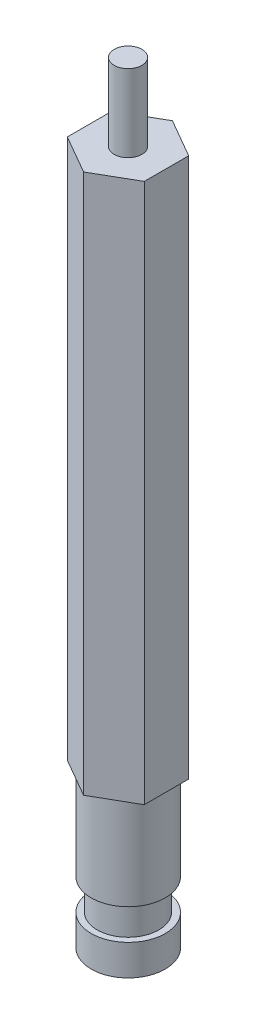
ISO-10303-21;
HEADER;
FILE_DESCRIPTION(('STEP AP214'),'2;1');
FILE_NAME('part.step','',(''),(''),'','','');
FILE_SCHEMA(('AUTOMOTIVE_DESIGN { 1 0 10303 214 1 1 1 1 }'));
ENDSEC;
DATA;
#1=APPLICATION_CONTEXT('core data for automotive mechanical design processes');
#2=APPLICATION_PROTOCOL_DEFINITION('international standard','automotive_design',2000,#1);
#3=PRODUCT_CONTEXT('',#1,'mechanical');
#4=PRODUCT('Part','Part','',(#3));
#5=PRODUCT_RELATED_PRODUCT_CATEGORY('part','',(#4));
#6=PRODUCT_DEFINITION_FORMATION('','',#4);
#7=PRODUCT_DEFINITION_CONTEXT('part definition',#1,'design');
#8=PRODUCT_DEFINITION('design','',#6,#7);
#9=PRODUCT_DEFINITION_SHAPE('','',#8);
#10=(LENGTH_UNIT() NAMED_UNIT(*) SI_UNIT(.MILLI.,.METRE.));
#11=(NAMED_UNIT(*) PLANE_ANGLE_UNIT() SI_UNIT($,.RADIAN.));
#12=(NAMED_UNIT(*) SI_UNIT($,.STERADIAN.) SOLID_ANGLE_UNIT());
#13=UNCERTAINTY_MEASURE_WITH_UNIT(LENGTH_MEASURE(1.E-05),#10,'distance_accuracy_value','');
#14=(GEOMETRIC_REPRESENTATION_CONTEXT(3) GLOBAL_UNCERTAINTY_ASSIGNED_CONTEXT((#13)) GLOBAL_UNIT_ASSIGNED_CONTEXT((#10,
#11,#12)) REPRESENTATION_CONTEXT('',''));
#15=CARTESIAN_POINT('',(0.,0.,0.));
#16=DIRECTION('',(0.,0.,1.));
#17=DIRECTION('',(1.,0.,0.));
#18=AXIS2_PLACEMENT_3D('',#15,#16,#17);
#19=CARTESIAN_POINT('',(0.152614949044713,12.7,2.58450279961206));
#20=DIRECTION('',(0.,-1.,0.));
#21=DIRECTION('',(0.,0.,-1.));
#22=AXIS2_PLACEMENT_3D('',#19,#20,#21);
#23=CYLINDRICAL_SURFACE('',#22,3.048);
#24=CARTESIAN_POINT('',(0.152614949044713,12.7,2.58450279961206));
#25=DIRECTION('',(0.,-1.,0.));
#26=DIRECTION('',(0.,0.,-1.));
#27=AXIS2_PLACEMENT_3D('',#24,#25,#26);
#28=CIRCLE('',#27,3.048);
#29=CARTESIAN_POINT('',(0.152614949044713,12.7,-0.463497200387935));
#30=VERTEX_POINT('',#29);
#31=EDGE_CURVE('E103',#30,#30,#28,.T.);
#32=ORIENTED_EDGE('',*,*,#31,.T.);
#33=EDGE_LOOP('',(#32));
#34=FACE_BOUND('',#33,.T.);
#35=CARTESIAN_POINT('',(0.152614949044713,5.08,2.58450279961206));
#36=DIRECTION('',(0.,-1.,0.));
#37=DIRECTION('',(0.,0.,-1.));
#38=AXIS2_PLACEMENT_3D('',#35,#36,#37);
#39=CIRCLE('',#38,3.048);
#40=CARTESIAN_POINT('',(0.152614949044713,5.08,-0.463497200387935));
#41=VERTEX_POINT('',#40);
#42=EDGE_CURVE('E40',#41,#41,#39,.F.);
#43=ORIENTED_EDGE('',*,*,#42,.T.);
#44=EDGE_LOOP('',(#43));
#45=FACE_BOUND('',#44,.T.);
#46=ADVANCED_FACE('F36',(#34,#45),#23,.T.);
#47=CARTESIAN_POINT('',(0.14076501932061,63.5,-1.06306101828332));
#48=DIRECTION('',(0.499122205111676,0.,0.86653160609666));
#49=DIRECTION('',(0.86653160609666,0.,-0.499122205111676));
#50=AXIS2_PLACEMENT_3D('',#47,#48,#49);
#51=PLANE('',#50);
#52=DIRECTION('',(0.86653160609666,0.,-0.499122205111676));
#53=VECTOR('',#52,1.);
#54=CARTESIAN_POINT('',(0.14076501932061,12.7,-1.06306101828332));
#55=LINE('',#54,#53);
#56=CARTESIAN_POINT('',(-3.02866098313853,12.7,0.762528359133148));
#57=VERTEX_POINT('',#56);
#58=CARTESIAN_POINT('',(0.14076501932061,12.7,-1.06306101828332));
#59=VERTEX_POINT('',#58);
#60=EDGE_CURVE('E52',#57,#59,#55,.T.);
#61=ORIENTED_EDGE('',*,*,#60,.F.);
#62=DIRECTION('',(0.,-1.,0.));
#63=VECTOR('',#62,1.);
#64=CARTESIAN_POINT('',(-3.02866098313853,63.5,0.762528359133148));
#65=LINE('',#64,#63);
#66=CARTESIAN_POINT('',(-3.02866098313853,57.15,0.762528359133148));
#67=VERTEX_POINT('',#66);
#68=EDGE_CURVE('E119',#67,#57,#65,.T.);
#69=ORIENTED_EDGE('',*,*,#68,.F.);
#70=DIRECTION('',(-0.86653160609666,0.,0.499122205111676));
#71=VECTOR('',#70,1.);
#72=CARTESIAN_POINT('',(0.14076501932061,57.15,-1.06306101828332));
#73=LINE('',#72,#71);
#74=CARTESIAN_POINT('',(0.14076501932061,57.15,-1.06306101828332));
#75=VERTEX_POINT('',#74);
#76=EDGE_CURVE('E110',#75,#67,#73,.T.);
#77=ORIENTED_EDGE('',*,*,#76,.F.);
#78=DIRECTION('',(0.,-1.,0.));
#79=VECTOR('',#78,1.);
#80=CARTESIAN_POINT('',(0.14076501932061,63.5,-1.06306101828332));
#81=LINE('',#80,#79);
#82=EDGE_CURVE('E106',#75,#59,#81,.T.);
#83=ORIENTED_EDGE('',*,*,#82,.T.);
#84=EDGE_LOOP('',(#61,#69,#77,#83));
#85=FACE_BOUND('',#84,.T.);
#86=ADVANCED_FACE('F38',(#85),#51,.F.);
#87=CARTESIAN_POINT('',(-3.02866098313853,63.5,0.762528359133148));
#88=DIRECTION('',(1.,0.,0.));
#89=DIRECTION('',(0.,0.,-1.));
#90=AXIS2_PLACEMENT_3D('',#87,#88,#89);
#91=PLANE('',#90);
#92=DIRECTION('',(0.,0.,-1.));
#93=VECTOR('',#92,1.);
#94=CARTESIAN_POINT('',(-3.02866098313853,12.7,0.762528359133148));
#95=LINE('',#94,#93);
#96=CARTESIAN_POINT('',(-3.02866098313853,12.7,4.42012835913315));
#97=VERTEX_POINT('',#96);
#98=EDGE_CURVE('E144',#97,#57,#95,.T.);
#99=ORIENTED_EDGE('',*,*,#98,.F.);
#100=DIRECTION('',(0.,-1.,0.));
#101=VECTOR('',#100,1.);
#102=CARTESIAN_POINT('',(-3.02866098313853,63.5,4.42012835913315));
#103=LINE('',#102,#101);
#104=CARTESIAN_POINT('',(-3.02866098313853,57.15,4.42012835913315));
#105=VERTEX_POINT('',#104);
#106=EDGE_CURVE('E116',#105,#97,#103,.T.);
#107=ORIENTED_EDGE('',*,*,#106,.F.);
#108=DIRECTION('',(0.,0.,1.));
#109=VECTOR('',#108,1.);
#110=CARTESIAN_POINT('',(-3.02866098313853,57.15,0.762528359133148));
#111=LINE('',#110,#109);
#112=EDGE_CURVE('E158',#67,#105,#111,.T.);
#113=ORIENTED_EDGE('',*,*,#112,.F.);
#114=ORIENTED_EDGE('',*,*,#68,.T.);
#115=EDGE_LOOP('',(#99,#107,#113,#114));
#116=FACE_BOUND('',#115,.T.);
#117=ADVANCED_FACE('F168',(#116),#91,.F.);
#118=CARTESIAN_POINT('',(-3.02866098313853,63.5,4.42012835913315));
#119=DIRECTION('',(0.499122205111676,0.,-0.86653160609666));
#120=DIRECTION('',(-0.86653160609666,0.,-0.499122205111676));
#121=AXIS2_PLACEMENT_3D('',#118,#119,#120);
#122=PLANE('',#121);
#123=DIRECTION('',(-0.86653160609666,0.,-0.499122205111676));
#124=VECTOR('',#123,1.);
#125=CARTESIAN_POINT('',(-3.02866098313853,12.7,4.42012835913315));
#126=LINE('',#125,#124);
#127=CARTESIAN_POINT('',(0.140765019320611,12.7,6.24571773654962));
#128=VERTEX_POINT('',#127);
#129=EDGE_CURVE('E142',#128,#97,#126,.T.);
#130=ORIENTED_EDGE('',*,*,#129,.F.);
#131=DIRECTION('',(0.,-1.,0.));
#132=VECTOR('',#131,1.);
#133=CARTESIAN_POINT('',(0.140765019320611,63.5,6.24571773654962));
#134=LINE('',#133,#132);
#135=CARTESIAN_POINT('',(0.140765019320611,57.15,6.24571773654962));
#136=VERTEX_POINT('',#135);
#137=EDGE_CURVE('E108',#136,#128,#134,.T.);
#138=ORIENTED_EDGE('',*,*,#137,.F.);
#139=DIRECTION('',(0.86653160609666,0.,0.499122205111676));
#140=VECTOR('',#139,1.);
#141=CARTESIAN_POINT('',(-3.02866098313853,57.15,4.42012835913315));
#142=LINE('',#141,#140);
#143=EDGE_CURVE('E156',#105,#136,#142,.T.);
#144=ORIENTED_EDGE('',*,*,#143,.F.);
#145=ORIENTED_EDGE('',*,*,#106,.T.);
#146=EDGE_LOOP('',(#130,#138,#144,#145));
#147=FACE_BOUND('',#146,.T.);
#148=ADVANCED_FACE('F174',(#147),#122,.F.);
#149=CARTESIAN_POINT('',(0.140765019320611,63.5,6.24571773654962));
#150=DIRECTION('',(-0.499122205111677,0.,-0.86653160609666));
#151=DIRECTION('',(-0.86653160609666,0.,0.499122205111677));
#152=AXIS2_PLACEMENT_3D('',#149,#150,#151);
#153=PLANE('',#152);
#154=DIRECTION('',(-0.86653160609666,0.,0.499122205111677));
#155=VECTOR('',#154,1.);
#156=CARTESIAN_POINT('',(0.140765019320611,12.7,6.24571773654962));
#157=LINE('',#156,#155);
#158=CARTESIAN_POINT('',(3.31019102177975,12.7,4.42012835913315));
#159=VERTEX_POINT('',#158);
#160=EDGE_CURVE('E102',#159,#128,#157,.T.);
#161=ORIENTED_EDGE('',*,*,#160,.F.);
#162=DIRECTION('',(0.,-1.,0.));
#163=VECTOR('',#162,1.);
#164=CARTESIAN_POINT('',(3.31019102177975,63.5,4.42012835913315));
#165=LINE('',#164,#163);
#166=CARTESIAN_POINT('',(3.31019102177975,57.15,4.42012835913315));
#167=VERTEX_POINT('',#166);
#168=EDGE_CURVE('E101',#167,#159,#165,.T.);
#169=ORIENTED_EDGE('',*,*,#168,.F.);
#170=DIRECTION('',(0.86653160609666,0.,-0.499122205111677));
#171=VECTOR('',#170,1.);
#172=CARTESIAN_POINT('',(0.140765019320611,57.15,6.24571773654962));
#173=LINE('',#172,#171);
#174=EDGE_CURVE('E154',#136,#167,#173,.T.);
#175=ORIENTED_EDGE('',*,*,#174,.F.);
#176=ORIENTED_EDGE('',*,*,#137,.T.);
#177=EDGE_LOOP('',(#161,#169,#175,#176));
#178=FACE_BOUND('',#177,.T.);
#179=ADVANCED_FACE('F207',(#178),#153,.F.);
#180=CARTESIAN_POINT('',(3.31019102177975,63.5,4.42012835913315));
#181=DIRECTION('',(-1.,0.,0.));
#182=DIRECTION('',(0.,0.,1.));
#183=AXIS2_PLACEMENT_3D('',#180,#181,#182);
#184=PLANE('',#183);
#185=DIRECTION('',(0.,0.,1.));
#186=VECTOR('',#185,1.);
#187=CARTESIAN_POINT('',(3.31019102177975,12.7,4.42012835913315));
#188=LINE('',#187,#186);
#189=CARTESIAN_POINT('',(3.31019102177975,12.7,0.762528359133148));
#190=VERTEX_POINT('',#189);
#191=EDGE_CURVE('E89',#190,#159,#188,.T.);
#192=ORIENTED_EDGE('',*,*,#191,.F.);
#193=DIRECTION('',(0.,-1.,0.));
#194=VECTOR('',#193,1.);
#195=CARTESIAN_POINT('',(3.31019102177975,63.5,0.762528359133148));
#196=LINE('',#195,#194);
#197=CARTESIAN_POINT('',(3.31019102177975,57.15,0.762528359133148));
#198=VERTEX_POINT('',#197);
#199=EDGE_CURVE('E99',#198,#190,#196,.T.);
#200=ORIENTED_EDGE('',*,*,#199,.F.);
#201=DIRECTION('',(0.,0.,-1.));
#202=VECTOR('',#201,1.);
#203=CARTESIAN_POINT('',(3.31019102177975,57.15,4.42012835913315));
#204=LINE('',#203,#202);
#205=EDGE_CURVE('E60',#167,#198,#204,.T.);
#206=ORIENTED_EDGE('',*,*,#205,.F.);
#207=ORIENTED_EDGE('',*,*,#168,.T.);
#208=EDGE_LOOP('',(#192,#200,#206,#207));
#209=FACE_BOUND('',#208,.T.);
#210=ADVANCED_FACE('F98',(#209),#184,.F.);
#211=CARTESIAN_POINT('',(3.31019102177975,63.5,0.762528359133148));
#212=DIRECTION('',(-0.499122205111676,0.,0.86653160609666));
#213=DIRECTION('',(0.86653160609666,0.,0.499122205111676));
#214=AXIS2_PLACEMENT_3D('',#211,#212,#213);
#215=PLANE('',#214);
#216=DIRECTION('',(0.86653160609666,0.,0.499122205111676));
#217=VECTOR('',#216,1.);
#218=CARTESIAN_POINT('',(3.31019102177975,12.7,0.762528359133148));
#219=LINE('',#218,#217);
#220=EDGE_CURVE('E12',#59,#190,#219,.T.);
#221=ORIENTED_EDGE('',*,*,#220,.F.);
#222=ORIENTED_EDGE('',*,*,#82,.F.);
#223=DIRECTION('',(-0.86653160609666,0.,-0.499122205111676));
#224=VECTOR('',#223,1.);
#225=CARTESIAN_POINT('',(3.31019102177975,57.15,0.762528359133148));
#226=LINE('',#225,#224);
#227=EDGE_CURVE('E45',#198,#75,#226,.T.);
#228=ORIENTED_EDGE('',*,*,#227,.F.);
#229=ORIENTED_EDGE('',*,*,#199,.T.);
#230=EDGE_LOOP('',(#221,#222,#228,#229));
#231=FACE_BOUND('',#230,.T.);
#232=ADVANCED_FACE('F105',(#231),#215,.F.);
#233=CARTESIAN_POINT('',(0.14076501932061,57.15,2.59132835913315));
#234=DIRECTION('',(0.,1.,0.));
#235=DIRECTION('',(0.,0.,1.));
#236=AXIS2_PLACEMENT_3D('',#233,#234,#235);
#237=PLANE('',#236);
#238=CARTESIAN_POINT('',(0.146339016861466,57.15,2.59132835913315));
#239=DIRECTION('',(0.,1.,0.));
#240=DIRECTION('',(0.,0.,1.));
#241=AXIS2_PLACEMENT_3D('',#238,#239,#240);
#242=CIRCLE('',#241,1.143);
#243=CARTESIAN_POINT('',(0.146339016861466,57.15,3.73432835913315));
#244=VERTEX_POINT('',#243);
#245=EDGE_CURVE('E148',#244,#244,#242,.T.);
#246=ORIENTED_EDGE('',*,*,#245,.F.);
#247=EDGE_LOOP('',(#246));
#248=FACE_BOUND('',#247,.T.);
#249=ORIENTED_EDGE('',*,*,#76,.T.);
#250=ORIENTED_EDGE('',*,*,#112,.T.);
#251=ORIENTED_EDGE('',*,*,#143,.T.);
#252=ORIENTED_EDGE('',*,*,#174,.T.);
#253=ORIENTED_EDGE('',*,*,#205,.T.);
#254=ORIENTED_EDGE('',*,*,#227,.T.);
#255=EDGE_LOOP('',(#249,#250,#251,#252,#253,#254));
#256=FACE_BOUND('',#255,.T.);
#257=ADVANCED_FACE('F161',(#248,#256),#237,.T.);
#258=CARTESIAN_POINT('',(0.146339016861466,57.15,2.59132835913315));
#259=DIRECTION('',(0.,1.,0.));
#260=DIRECTION('',(0.,0.,1.));
#261=AXIS2_PLACEMENT_3D('',#258,#259,#260);
#262=CYLINDRICAL_SURFACE('',#261,1.143);
#263=ORIENTED_EDGE('',*,*,#245,.T.);
#264=EDGE_LOOP('',(#263));
#265=FACE_BOUND('',#264,.T.);
#266=CARTESIAN_POINT('',(0.146339016861466,63.5,2.59132835913315));
#267=DIRECTION('',(0.,1.,0.));
#268=DIRECTION('',(0.,0.,1.));
#269=AXIS2_PLACEMENT_3D('',#266,#267,#268);
#270=CIRCLE('',#269,1.143);
#271=CARTESIAN_POINT('',(0.146339016861466,63.5,3.73432835913315));
#272=VERTEX_POINT('',#271);
#273=EDGE_CURVE('E147',#272,#272,#270,.T.);
#274=ORIENTED_EDGE('',*,*,#273,.F.);
#275=EDGE_LOOP('',(#274));
#276=FACE_BOUND('',#275,.T.);
#277=ADVANCED_FACE('F239',(#265,#276),#262,.T.);
#278=CARTESIAN_POINT('',(-3.02866098313853,63.5,0.762528359133148));
#279=DIRECTION('',(0.,1.,0.));
#280=DIRECTION('',(0.,0.,1.));
#281=AXIS2_PLACEMENT_3D('',#278,#279,#280);
#282=PLANE('',#281);
#283=ORIENTED_EDGE('',*,*,#273,.T.);
#284=EDGE_LOOP('',(#283));
#285=FACE_BOUND('',#284,.T.);
#286=ADVANCED_FACE('F201',(#285),#282,.T.);
#287=CARTESIAN_POINT('',(0.14076501932061,12.7,2.59132835913315));
#288=DIRECTION('',(0.,-1.,0.));
#289=DIRECTION('',(0.,0.,-1.));
#290=AXIS2_PLACEMENT_3D('',#287,#288,#289);
#291=PLANE('',#290);
#292=ORIENTED_EDGE('',*,*,#31,.F.);
#293=EDGE_LOOP('',(#292));
#294=FACE_BOUND('',#293,.T.);
#295=ORIENTED_EDGE('',*,*,#60,.T.);
#296=ORIENTED_EDGE('',*,*,#220,.T.);
#297=ORIENTED_EDGE('',*,*,#191,.T.);
#298=ORIENTED_EDGE('',*,*,#160,.T.);
#299=ORIENTED_EDGE('',*,*,#129,.T.);
#300=ORIENTED_EDGE('',*,*,#98,.T.);
#301=EDGE_LOOP('',(#295,#296,#297,#298,#299,#300));
#302=FACE_BOUND('',#301,.T.);
#303=ADVANCED_FACE('F88',(#294,#302),#291,.T.);
#304=CARTESIAN_POINT('',(0.14076501932061,5.08,2.59132835913315));
#305=DIRECTION('',(0.,-1.,0.));
#306=DIRECTION('',(0.,0.,-1.));
#307=AXIS2_PLACEMENT_3D('',#304,#305,#306);
#308=PLANE('',#307);
#309=ORIENTED_EDGE('',*,*,#42,.F.);
#310=EDGE_LOOP('',(#309));
#311=FACE_BOUND('',#310,.T.);
#312=CARTESIAN_POINT('',(0.140765019320611,5.08,2.59132835913315));
#313=DIRECTION('',(0.,-1.,0.));
#314=DIRECTION('',(0.,0.,-1.));
#315=AXIS2_PLACEMENT_3D('',#312,#313,#314);
#316=CIRCLE('',#315,2.54);
#317=CARTESIAN_POINT('',(0.140765019320611,5.08,0.0513283591331488));
#318=VERTEX_POINT('',#317);
#319=EDGE_CURVE('E124',#318,#318,#316,.T.);
#320=ORIENTED_EDGE('',*,*,#319,.F.);
#321=EDGE_LOOP('',(#320));
#322=FACE_BOUND('',#321,.T.);
#323=ADVANCED_FACE('F258',(#311,#322),#308,.T.);
#324=CARTESIAN_POINT('',(0.14076501932061,2.54,2.59132835913315));
#325=DIRECTION('',(0.,-1.,0.));
#326=DIRECTION('',(0.,0.,-1.));
#327=AXIS2_PLACEMENT_3D('',#324,#325,#326);
#328=PLANE('',#327);
#329=CARTESIAN_POINT('',(0.152614949044713,2.54,2.58450279961206));
#330=DIRECTION('',(0.,-1.,0.));
#331=DIRECTION('',(0.,0.,-1.));
#332=AXIS2_PLACEMENT_3D('',#329,#330,#331);
#333=CIRCLE('',#332,3.048);
#334=CARTESIAN_POINT('',(0.152614949044713,2.54,-0.463497200387935));
#335=VERTEX_POINT('',#334);
#336=EDGE_CURVE('E122',#335,#335,#333,.F.);
#337=ORIENTED_EDGE('',*,*,#336,.T.);
#338=EDGE_LOOP('',(#337));
#339=FACE_BOUND('',#338,.T.);
#340=CARTESIAN_POINT('',(0.140765019320611,2.54,2.59132835913315));
#341=DIRECTION('',(0.,-1.,0.));
#342=DIRECTION('',(0.,0.,-1.));
#343=AXIS2_PLACEMENT_3D('',#340,#341,#342);
#344=CIRCLE('',#343,2.54);
#345=CARTESIAN_POINT('',(0.140765019320611,2.54,0.0513283591331488));
#346=VERTEX_POINT('',#345);
#347=EDGE_CURVE('E130',#346,#346,#344,.T.);
#348=ORIENTED_EDGE('',*,*,#347,.T.);
#349=EDGE_LOOP('',(#348));
#350=FACE_BOUND('',#349,.T.);
#351=ADVANCED_FACE('F197',(#339,#350),#328,.F.);
#352=CARTESIAN_POINT('',(0.140765019320611,5.08,2.59132835913315));
#353=DIRECTION('',(0.,-1.,0.));
#354=DIRECTION('',(0.,0.,-1.));
#355=AXIS2_PLACEMENT_3D('',#352,#353,#354);
#356=CYLINDRICAL_SURFACE('',#355,2.54);
#357=ORIENTED_EDGE('',*,*,#319,.T.);
#358=EDGE_LOOP('',(#357));
#359=FACE_BOUND('',#358,.T.);
#360=ORIENTED_EDGE('',*,*,#347,.F.);
#361=EDGE_LOOP('',(#360));
#362=FACE_BOUND('',#361,.T.);
#363=ADVANCED_FACE('F189',(#359,#362),#356,.T.);
#364=CARTESIAN_POINT('',(-3.02866098313853,0.,0.762528359133148));
#365=DIRECTION('',(0.,1.,0.));
#366=DIRECTION('',(0.,0.,1.));
#367=AXIS2_PLACEMENT_3D('',#364,#365,#366);
#368=PLANE('',#367);
#369=CARTESIAN_POINT('',(0.152614949044713,0.,2.58450279961206));
#370=DIRECTION('',(0.,-1.,0.));
#371=DIRECTION('',(0.,0.,-1.));
#372=AXIS2_PLACEMENT_3D('',#369,#370,#371);
#373=CIRCLE('',#372,3.048);
#374=CARTESIAN_POINT('',(0.152614949044713,0.,-0.463497200387935));
#375=VERTEX_POINT('',#374);
#376=EDGE_CURVE('E128',#375,#375,#373,.T.);
#377=ORIENTED_EDGE('',*,*,#376,.T.);
#378=EDGE_LOOP('',(#377));
#379=FACE_BOUND('',#378,.T.);
#380=ADVANCED_FACE('F184',(#379),#368,.F.);
#381=ORIENTED_EDGE('',*,*,#336,.F.);
#382=EDGE_LOOP('',(#381));
#383=FACE_BOUND('',#382,.T.);
#384=ORIENTED_EDGE('',*,*,#376,.F.);
#385=EDGE_LOOP('',(#384));
#386=FACE_BOUND('',#385,.T.);
#387=ADVANCED_FACE('F177',(#383,#386),#23,.T.);
#388=CLOSED_SHELL('',(#46,#86,#117,#148,#179,#210,#232,#257,#277,#286,#303,#323,#351,#363,#380,#387));
#389=MANIFOLD_SOLID_BREP('B2',#388);
#390=ADVANCED_BREP_SHAPE_REPRESENTATION('',(#18,#389),#14);
#391=SHAPE_DEFINITION_REPRESENTATION(#9,#390);
ENDSEC;
END-ISO-10303-21;
